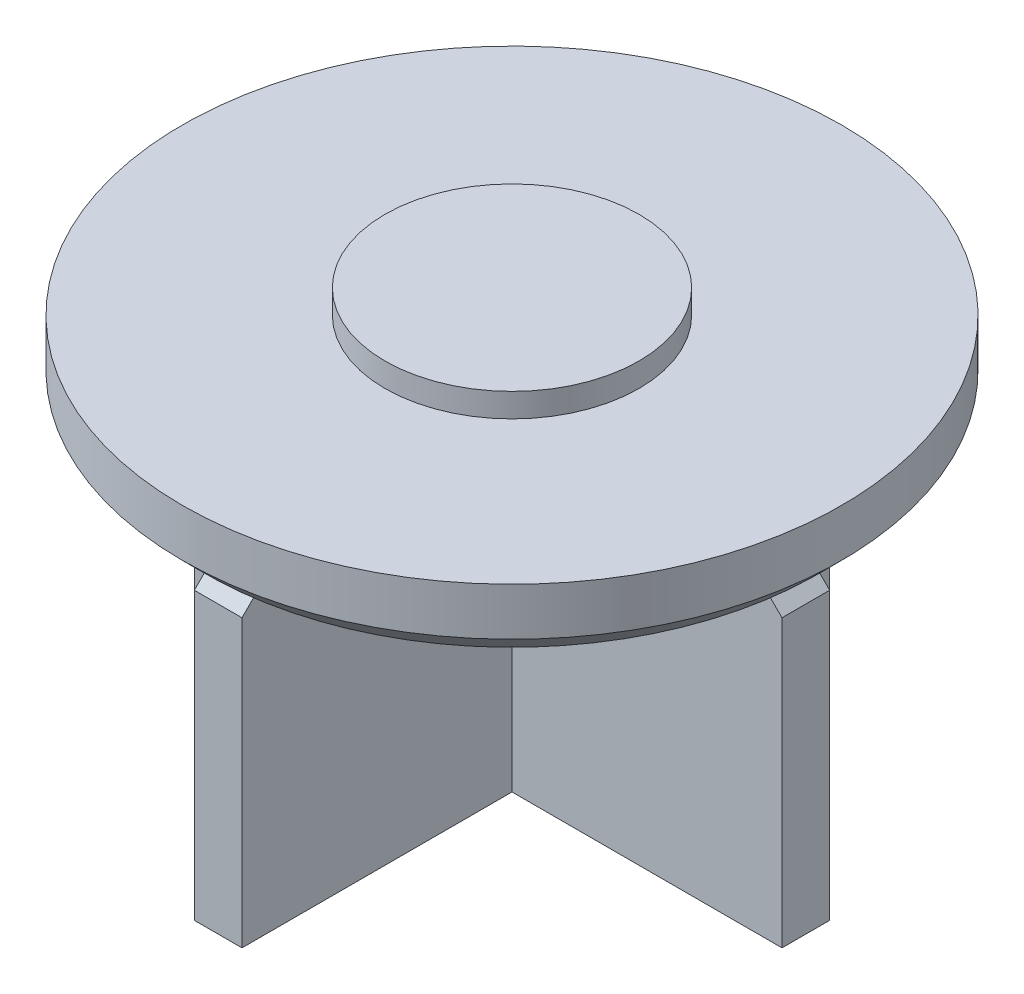
ISO-10303-21;
HEADER;
FILE_DESCRIPTION(('STEP AP214'),'2;1');
FILE_NAME('part.step','',(''),(''),'','','');
FILE_SCHEMA(('AUTOMOTIVE_DESIGN { 1 0 10303 214 1 1 1 1 }'));
ENDSEC;
DATA;
#1=APPLICATION_CONTEXT('core data for automotive mechanical design processes');
#2=APPLICATION_PROTOCOL_DEFINITION('international standard','automotive_design',2000,#1);
#3=PRODUCT_CONTEXT('',#1,'mechanical');
#4=PRODUCT('Part','Part','',(#3));
#5=PRODUCT_RELATED_PRODUCT_CATEGORY('part','',(#4));
#6=PRODUCT_DEFINITION_FORMATION('','',#4);
#7=PRODUCT_DEFINITION_CONTEXT('part definition',#1,'design');
#8=PRODUCT_DEFINITION('design','',#6,#7);
#9=PRODUCT_DEFINITION_SHAPE('','',#8);
#10=(LENGTH_UNIT() NAMED_UNIT(*) SI_UNIT(.MILLI.,.METRE.));
#11=(NAMED_UNIT(*) PLANE_ANGLE_UNIT() SI_UNIT($,.RADIAN.));
#12=(NAMED_UNIT(*) SI_UNIT($,.STERADIAN.) SOLID_ANGLE_UNIT());
#13=UNCERTAINTY_MEASURE_WITH_UNIT(LENGTH_MEASURE(1.E-05),#10,'distance_accuracy_value','');
#14=(GEOMETRIC_REPRESENTATION_CONTEXT(3) GLOBAL_UNCERTAINTY_ASSIGNED_CONTEXT((#13)) GLOBAL_UNIT_ASSIGNED_CONTEXT((#10,
#11,#12)) REPRESENTATION_CONTEXT('',''));
#15=CARTESIAN_POINT('',(0.,0.,0.));
#16=DIRECTION('',(0.,0.,1.));
#17=DIRECTION('',(1.,0.,0.));
#18=AXIS2_PLACEMENT_3D('',#15,#16,#17);
#19=CARTESIAN_POINT('',(0.,0.,0.));
#20=DIRECTION('',(0.,-1.,0.));
#21=DIRECTION('',(0.,0.,-1.));
#22=AXIS2_PLACEMENT_3D('',#19,#20,#21);
#23=PLANE('',#22);
#24=CARTESIAN_POINT('',(0.,0.,0.));
#25=DIRECTION('',(0.,-1.,0.));
#26=DIRECTION('',(0.,0.,-1.));
#27=AXIS2_PLACEMENT_3D('',#24,#25,#26);
#28=CIRCLE('',#27,16.);
#29=CARTESIAN_POINT('',(0.,0.,-16.));
#30=VERTEX_POINT('',#29);
#31=EDGE_CURVE('E40',#30,#30,#28,.T.);
#32=ORIENTED_EDGE('',*,*,#31,.F.);
#33=EDGE_LOOP('',(#32));
#34=FACE_BOUND('',#33,.T.);
#35=ADVANCED_FACE('F33',(#34),#23,.F.);
#36=CARTESIAN_POINT('',(0.,-12.,0.));
#37=DIRECTION('',(0.,-1.,0.));
#38=DIRECTION('',(0.,0.,-1.));
#39=AXIS2_PLACEMENT_3D('',#36,#37,#38);
#40=CYLINDRICAL_SURFACE('',#39,16.);
#41=CARTESIAN_POINT('',(0.,-3.,0.));
#42=DIRECTION('',(0.,-1.,0.));
#43=DIRECTION('',(0.,0.,-1.));
#44=AXIS2_PLACEMENT_3D('',#41,#42,#43);
#45=CIRCLE('',#44,16.);
#46=CARTESIAN_POINT('',(0.,-3.,-16.));
#47=VERTEX_POINT('',#46);
#48=EDGE_CURVE('E274',#47,#47,#45,.T.);
#49=ORIENTED_EDGE('',*,*,#48,.F.);
#50=EDGE_LOOP('',(#49));
#51=FACE_BOUND('',#50,.T.);
#52=ORIENTED_EDGE('',*,*,#31,.T.);
#53=EDGE_LOOP('',(#52));
#54=FACE_BOUND('',#53,.T.);
#55=ADVANCED_FACE('F279',(#51,#54),#40,.T.);
#56=CARTESIAN_POINT('',(-16.,-3.,0.));
#57=DIRECTION('',(0.,-1.,0.));
#58=DIRECTION('',(0.,0.,-1.));
#59=AXIS2_PLACEMENT_3D('',#56,#57,#58);
#60=PLANE('',#59);
#61=CARTESIAN_POINT('',(0.,-3.,0.));
#62=DIRECTION('',(0.,-1.,0.));
#63=DIRECTION('',(0.,0.,-1.));
#64=AXIS2_PLACEMENT_3D('',#61,#62,#63);
#65=CIRCLE('',#64,41.5);
#66=CARTESIAN_POINT('',(0.,-3.,-41.5));
#67=VERTEX_POINT('',#66);
#68=EDGE_CURVE('E271',#67,#67,#65,.T.);
#69=ORIENTED_EDGE('',*,*,#68,.F.);
#70=EDGE_LOOP('',(#69));
#71=FACE_BOUND('',#70,.T.);
#72=ORIENTED_EDGE('',*,*,#48,.T.);
#73=EDGE_LOOP('',(#72));
#74=FACE_BOUND('',#73,.T.);
#75=ADVANCED_FACE('F285',(#71,#74),#60,.F.);
#76=CARTESIAN_POINT('',(0.,-12.,0.));
#77=DIRECTION('',(0.,-1.,0.));
#78=DIRECTION('',(0.,0.,-1.));
#79=AXIS2_PLACEMENT_3D('',#76,#77,#78);
#80=CYLINDRICAL_SURFACE('',#79,41.5);
#81=CARTESIAN_POINT('',(0.,-9.00000000000001,0.));
#82=DIRECTION('',(0.,-1.,0.));
#83=DIRECTION('',(0.,0.,-1.));
#84=AXIS2_PLACEMENT_3D('',#81,#82,#83);
#85=CIRCLE('',#84,41.5);
#86=CARTESIAN_POINT('',(0.,-9.00000000000001,-41.5));
#87=VERTEX_POINT('',#86);
#88=EDGE_CURVE('E268',#87,#87,#85,.T.);
#89=ORIENTED_EDGE('',*,*,#88,.F.);
#90=EDGE_LOOP('',(#89));
#91=FACE_BOUND('',#90,.T.);
#92=ORIENTED_EDGE('',*,*,#68,.T.);
#93=EDGE_LOOP('',(#92));
#94=FACE_BOUND('',#93,.T.);
#95=ADVANCED_FACE('F290',(#91,#94),#80,.T.);
#96=CARTESIAN_POINT('',(0.,-9.00000000000001,0.));
#97=DIRECTION('',(0.,1.,0.));
#98=DIRECTION('',(0.,0.,1.));
#99=AXIS2_PLACEMENT_3D('',#96,#97,#98);
#100=CONICAL_SURFACE('',#99,41.5,0.78539816339745);
#101=CARTESIAN_POINT('',(0.,-12.,0.));
#102=DIRECTION('',(0.,-1.,0.));
#103=DIRECTION('',(0.,0.,-1.));
#104=AXIS2_PLACEMENT_3D('',#101,#102,#103);
#105=CIRCLE('',#104,38.5);
#106=CARTESIAN_POINT('',(0.,-12.,-38.5));
#107=VERTEX_POINT('',#106);
#108=EDGE_CURVE('E265',#107,#107,#105,.T.);
#109=ORIENTED_EDGE('',*,*,#108,.F.);
#110=EDGE_LOOP('',(#109));
#111=FACE_BOUND('',#110,.T.);
#112=ORIENTED_EDGE('',*,*,#88,.T.);
#113=EDGE_LOOP('',(#112));
#114=FACE_BOUND('',#113,.T.);
#115=ADVANCED_FACE('F297',(#111,#114),#100,.T.);
#116=CARTESIAN_POINT('',(-38.5,-12.,0.));
#117=DIRECTION('',(0.,1.,0.));
#118=DIRECTION('',(0.,0.,1.));
#119=AXIS2_PLACEMENT_3D('',#116,#117,#118);
#120=PLANE('',#119);
#121=DIRECTION('',(-1.,0.,0.));
#122=VECTOR('',#121,1.);
#123=CARTESIAN_POINT('',(33.,-12.,-3.));
#124=LINE('',#123,#122);
#125=CARTESIAN_POINT('',(33.,-12.,-3.));
#126=VERTEX_POINT('',#125);
#127=CARTESIAN_POINT('',(2.99999999999999,-12.,-3.));
#128=VERTEX_POINT('',#127);
#129=EDGE_CURVE('E240',#126,#128,#124,.T.);
#130=ORIENTED_EDGE('',*,*,#129,.T.);
#131=DIRECTION('',(0.,0.,1.));
#132=VECTOR('',#131,1.);
#133=CARTESIAN_POINT('',(2.99999999999988,-12.,-33.));
#134=LINE('',#133,#132);
#135=CARTESIAN_POINT('',(2.99999999999988,-12.,-33.));
#136=VERTEX_POINT('',#135);
#137=EDGE_CURVE('E47',#136,#128,#134,.T.);
#138=ORIENTED_EDGE('',*,*,#137,.F.);
#139=DIRECTION('',(-1.,0.,0.));
#140=VECTOR('',#139,1.);
#141=CARTESIAN_POINT('',(2.99999999999988,-12.,-33.));
#142=LINE('',#141,#140);
#143=CARTESIAN_POINT('',(-3.00000000000012,-12.,-33.));
#144=VERTEX_POINT('',#143);
#145=EDGE_CURVE('E218',#136,#144,#142,.T.);
#146=ORIENTED_EDGE('',*,*,#145,.T.);
#147=DIRECTION('',(0.,0.,1.));
#148=VECTOR('',#147,1.);
#149=CARTESIAN_POINT('',(-3.00000000000012,-12.,-33.));
#150=LINE('',#149,#148);
#151=CARTESIAN_POINT('',(-3.00000000000001,-12.,-3.));
#152=VERTEX_POINT('',#151);
#153=EDGE_CURVE('E209',#144,#152,#150,.T.);
#154=ORIENTED_EDGE('',*,*,#153,.T.);
#155=DIRECTION('',(1.,0.,0.));
#156=VECTOR('',#155,1.);
#157=CARTESIAN_POINT('',(-33.,-12.,-3.));
#158=LINE('',#157,#156);
#159=CARTESIAN_POINT('',(-33.,-12.,-3.));
#160=VERTEX_POINT('',#159);
#161=EDGE_CURVE('E183',#160,#152,#158,.T.);
#162=ORIENTED_EDGE('',*,*,#161,.F.);
#163=DIRECTION('',(0.,0.,1.));
#164=VECTOR('',#163,1.);
#165=CARTESIAN_POINT('',(-33.,-12.,-3.));
#166=LINE('',#165,#164);
#167=CARTESIAN_POINT('',(-33.,-12.,3.));
#168=VERTEX_POINT('',#167);
#169=EDGE_CURVE('E192',#160,#168,#166,.T.);
#170=ORIENTED_EDGE('',*,*,#169,.T.);
#171=DIRECTION('',(1.,0.,0.));
#172=VECTOR('',#171,1.);
#173=CARTESIAN_POINT('',(-33.,-12.,3.));
#174=LINE('',#173,#172);
#175=CARTESIAN_POINT('',(-2.99999999999997,-12.,3.));
#176=VERTEX_POINT('',#175);
#177=EDGE_CURVE('E163',#168,#176,#174,.T.);
#178=ORIENTED_EDGE('',*,*,#177,.T.);
#179=DIRECTION('',(0.,0.,-1.));
#180=VECTOR('',#179,1.);
#181=CARTESIAN_POINT('',(-2.99999999999965,-12.,33.));
#182=LINE('',#181,#180);
#183=CARTESIAN_POINT('',(-2.99999999999965,-12.,33.));
#184=VERTEX_POINT('',#183);
#185=EDGE_CURVE('E154',#184,#176,#182,.T.);
#186=ORIENTED_EDGE('',*,*,#185,.F.);
#187=DIRECTION('',(1.,0.,0.));
#188=VECTOR('',#187,1.);
#189=CARTESIAN_POINT('',(-2.99999999999965,-12.,33.));
#190=LINE('',#189,#188);
#191=CARTESIAN_POINT('',(3.00000000000035,-12.,33.));
#192=VERTEX_POINT('',#191);
#193=EDGE_CURVE('E171',#184,#192,#190,.T.);
#194=ORIENTED_EDGE('',*,*,#193,.T.);
#195=CARTESIAN_POINT('',(3.00000000000001,-12.,3.));
#196=VERTEX_POINT('',#195);
#197=EDGE_CURVE('E212',#196,#192,#134,.T.);
#198=ORIENTED_EDGE('',*,*,#197,.F.);
#199=DIRECTION('',(-1.,0.,0.));
#200=VECTOR('',#199,1.);
#201=CARTESIAN_POINT('',(33.,-12.,3.));
#202=LINE('',#201,#200);
#203=CARTESIAN_POINT('',(33.,-12.,3.));
#204=VERTEX_POINT('',#203);
#205=EDGE_CURVE('E54',#204,#196,#202,.T.);
#206=ORIENTED_EDGE('',*,*,#205,.F.);
#207=DIRECTION('',(0.,0.,-1.));
#208=VECTOR('',#207,1.);
#209=CARTESIAN_POINT('',(33.,-12.,3.));
#210=LINE('',#209,#208);
#211=EDGE_CURVE('E249',#204,#126,#210,.T.);
#212=ORIENTED_EDGE('',*,*,#211,.T.);
#213=EDGE_LOOP('',(#130,#138,#146,#154,#162,#170,#178,#186,#194,#198,#206,#212));
#214=FACE_BOUND('',#213,.T.);
#215=ORIENTED_EDGE('',*,*,#108,.T.);
#216=EDGE_LOOP('',(#215));
#217=FACE_BOUND('',#216,.T.);
#218=ADVANCED_FACE('F301',(#214,#217),#120,.F.);
#219=CARTESIAN_POINT('',(0.,-52.,3.));
#220=DIRECTION('',(0.,1.,0.));
#221=DIRECTION('',(0.,0.,1.));
#222=AXIS2_PLACEMENT_3D('',#219,#220,#221);
#223=PLANE('',#222);
#224=DIRECTION('',(1.,0.,0.));
#225=VECTOR('',#224,1.);
#226=CARTESIAN_POINT('',(0.,-52.,3.));
#227=LINE('',#226,#225);
#228=CARTESIAN_POINT('',(3.00000000000001,-52.,3.));
#229=VERTEX_POINT('',#228);
#230=CARTESIAN_POINT('',(37.,-52.,3.));
#231=VERTEX_POINT('',#230);
#232=EDGE_CURVE('E242',#229,#231,#227,.T.);
#233=ORIENTED_EDGE('',*,*,#232,.F.);
#234=DIRECTION('',(0.,0.,-1.));
#235=VECTOR('',#234,1.);
#236=CARTESIAN_POINT('',(3.,-52.,0.));
#237=LINE('',#236,#235);
#238=CARTESIAN_POINT('',(3.00000000000039,-52.,37.));
#239=VERTEX_POINT('',#238);
#240=EDGE_CURVE('E160',#239,#229,#237,.T.);
#241=ORIENTED_EDGE('',*,*,#240,.F.);
#242=DIRECTION('',(1.,0.,0.));
#243=VECTOR('',#242,1.);
#244=CARTESIAN_POINT('',(-2.99999999999961,-52.,37.));
#245=LINE('',#244,#243);
#246=CARTESIAN_POINT('',(-2.99999999999961,-52.,37.));
#247=VERTEX_POINT('',#246);
#248=EDGE_CURVE('E157',#247,#239,#245,.T.);
#249=ORIENTED_EDGE('',*,*,#248,.F.);
#250=DIRECTION('',(0.,0.,1.));
#251=VECTOR('',#250,1.);
#252=CARTESIAN_POINT('',(-3.,-52.,0.));
#253=LINE('',#252,#251);
#254=CARTESIAN_POINT('',(-2.99999999999997,-52.,3.));
#255=VERTEX_POINT('',#254);
#256=EDGE_CURVE('E144',#255,#247,#253,.T.);
#257=ORIENTED_EDGE('',*,*,#256,.F.);
#258=DIRECTION('',(-1.,0.,0.));
#259=VECTOR('',#258,1.);
#260=CARTESIAN_POINT('',(0.,-52.,3.));
#261=LINE('',#260,#259);
#262=CARTESIAN_POINT('',(-37.,-52.,3.));
#263=VERTEX_POINT('',#262);
#264=EDGE_CURVE('E195',#255,#263,#261,.T.);
#265=ORIENTED_EDGE('',*,*,#264,.T.);
#266=DIRECTION('',(0.,0.,1.));
#267=VECTOR('',#266,1.);
#268=CARTESIAN_POINT('',(-37.,-52.,-3.));
#269=LINE('',#268,#267);
#270=CARTESIAN_POINT('',(-37.,-52.,-3.));
#271=VERTEX_POINT('',#270);
#272=EDGE_CURVE('E205',#271,#263,#269,.T.);
#273=ORIENTED_EDGE('',*,*,#272,.F.);
#274=DIRECTION('',(-1.,0.,0.));
#275=VECTOR('',#274,1.);
#276=CARTESIAN_POINT('',(0.,-52.,-3.));
#277=LINE('',#276,#275);
#278=CARTESIAN_POINT('',(-3.00000000000001,-52.,-3.));
#279=VERTEX_POINT('',#278);
#280=EDGE_CURVE('E185',#279,#271,#277,.T.);
#281=ORIENTED_EDGE('',*,*,#280,.F.);
#282=DIRECTION('',(0.,0.,-1.));
#283=VECTOR('',#282,1.);
#284=CARTESIAN_POINT('',(-3.,-52.,0.));
#285=LINE('',#284,#283);
#286=CARTESIAN_POINT('',(-3.00000000000013,-52.,-37.));
#287=VERTEX_POINT('',#286);
#288=EDGE_CURVE('E221',#279,#287,#285,.T.);
#289=ORIENTED_EDGE('',*,*,#288,.T.);
#290=DIRECTION('',(-1.,0.,0.));
#291=VECTOR('',#290,1.);
#292=CARTESIAN_POINT('',(2.99999999999987,-52.,-37.));
#293=LINE('',#292,#291);
#294=CARTESIAN_POINT('',(2.99999999999987,-52.,-37.));
#295=VERTEX_POINT('',#294);
#296=EDGE_CURVE('E232',#295,#287,#293,.T.);
#297=ORIENTED_EDGE('',*,*,#296,.F.);
#298=CARTESIAN_POINT('',(2.99999999999999,-52.,-3.));
#299=VERTEX_POINT('',#298);
#300=EDGE_CURVE('E211',#299,#295,#237,.T.);
#301=ORIENTED_EDGE('',*,*,#300,.F.);
#302=DIRECTION('',(1.,0.,0.));
#303=VECTOR('',#302,1.);
#304=CARTESIAN_POINT('',(0.,-52.,-3.));
#305=LINE('',#304,#303);
#306=CARTESIAN_POINT('',(37.,-52.,-3.));
#307=VERTEX_POINT('',#306);
#308=EDGE_CURVE('E252',#299,#307,#305,.T.);
#309=ORIENTED_EDGE('',*,*,#308,.T.);
#310=DIRECTION('',(0.,0.,-1.));
#311=VECTOR('',#310,1.);
#312=CARTESIAN_POINT('',(37.,-52.,3.));
#313=LINE('',#312,#311);
#314=EDGE_CURVE('E262',#231,#307,#313,.T.);
#315=ORIENTED_EDGE('',*,*,#314,.F.);
#316=EDGE_LOOP('',(#233,#241,#249,#257,#265,#273,#281,#289,#297,#301,#309,#315));
#317=FACE_BOUND('',#316,.T.);
#318=ADVANCED_FACE('F159',(#317),#223,.F.);
#319=CARTESIAN_POINT('',(37.,-52.,3.));
#320=DIRECTION('',(-1.,0.,0.));
#321=DIRECTION('',(0.,0.,1.));
#322=AXIS2_PLACEMENT_3D('',#319,#320,#321);
#323=PLANE('',#322);
#324=DIRECTION('',(0.,1.,0.));
#325=VECTOR('',#324,1.);
#326=CARTESIAN_POINT('',(37.,-52.,-3.));
#327=LINE('',#326,#325);
#328=CARTESIAN_POINT('',(37.,-16.,-3.));
#329=VERTEX_POINT('',#328);
#330=EDGE_CURVE('E254',#307,#329,#327,.T.);
#331=ORIENTED_EDGE('',*,*,#330,.T.);
#332=DIRECTION('',(0.,0.,-1.));
#333=VECTOR('',#332,1.);
#334=CARTESIAN_POINT('',(37.,-16.,3.));
#335=LINE('',#334,#333);
#336=CARTESIAN_POINT('',(37.,-16.,3.));
#337=VERTEX_POINT('',#336);
#338=EDGE_CURVE('E259',#337,#329,#335,.T.);
#339=ORIENTED_EDGE('',*,*,#338,.F.);
#340=DIRECTION('',(0.,1.,0.));
#341=VECTOR('',#340,1.);
#342=CARTESIAN_POINT('',(37.,-52.,3.));
#343=LINE('',#342,#341);
#344=EDGE_CURVE('E245',#231,#337,#343,.T.);
#345=ORIENTED_EDGE('',*,*,#344,.F.);
#346=ORIENTED_EDGE('',*,*,#314,.T.);
#347=EDGE_LOOP('',(#331,#339,#345,#346));
#348=FACE_BOUND('',#347,.T.);
#349=ADVANCED_FACE('F307',(#348),#323,.F.);
#350=CARTESIAN_POINT('',(37.,-16.,3.));
#351=DIRECTION('',(-0.707106781186548,-0.707106781186546,0.));
#352=DIRECTION('',(0.707106781186546,-0.707106781186549,0.));
#353=AXIS2_PLACEMENT_3D('',#350,#351,#352);
#354=PLANE('',#353);
#355=DIRECTION('',(-0.707106781186546,0.707106781186549,0.));
#356=VECTOR('',#355,1.);
#357=CARTESIAN_POINT('',(37.,-16.,-3.));
#358=LINE('',#357,#356);
#359=EDGE_CURVE('E243',#329,#126,#358,.T.);
#360=ORIENTED_EDGE('',*,*,#359,.T.);
#361=ORIENTED_EDGE('',*,*,#211,.F.);
#362=DIRECTION('',(-0.707106781186546,0.707106781186549,0.));
#363=VECTOR('',#362,1.);
#364=CARTESIAN_POINT('',(37.,-16.,3.));
#365=LINE('',#364,#363);
#366=EDGE_CURVE('E247',#337,#204,#365,.T.);
#367=ORIENTED_EDGE('',*,*,#366,.F.);
#368=ORIENTED_EDGE('',*,*,#338,.T.);
#369=EDGE_LOOP('',(#360,#361,#367,#368));
#370=FACE_BOUND('',#369,.T.);
#371=ADVANCED_FACE('F310',(#370),#354,.F.);
#372=CARTESIAN_POINT('',(0.,0.,3.));
#373=DIRECTION('',(0.,0.,1.));
#374=DIRECTION('',(1.,0.,0.));
#375=AXIS2_PLACEMENT_3D('',#372,#373,#374);
#376=PLANE('',#375);
#377=DIRECTION('',(0.,1.,0.));
#378=VECTOR('',#377,1.);
#379=CARTESIAN_POINT('',(3.00000000000001,0.,3.));
#380=LINE('',#379,#378);
#381=EDGE_CURVE('E238',#229,#196,#380,.T.);
#382=ORIENTED_EDGE('',*,*,#381,.F.);
#383=ORIENTED_EDGE('',*,*,#232,.T.);
#384=ORIENTED_EDGE('',*,*,#344,.T.);
#385=ORIENTED_EDGE('',*,*,#366,.T.);
#386=ORIENTED_EDGE('',*,*,#205,.T.);
#387=EDGE_LOOP('',(#382,#383,#384,#385,#386));
#388=FACE_BOUND('',#387,.T.);
#389=ADVANCED_FACE('F314',(#388),#376,.T.);
#390=CARTESIAN_POINT('',(0.,0.,-3.));
#391=DIRECTION('',(0.,0.,1.));
#392=DIRECTION('',(1.,0.,0.));
#393=AXIS2_PLACEMENT_3D('',#390,#391,#392);
#394=PLANE('',#393);
#395=ORIENTED_EDGE('',*,*,#308,.F.);
#396=DIRECTION('',(0.,1.,0.));
#397=VECTOR('',#396,1.);
#398=CARTESIAN_POINT('',(2.99999999999999,0.,-3.));
#399=LINE('',#398,#397);
#400=EDGE_CURVE('E11',#299,#128,#399,.T.);
#401=ORIENTED_EDGE('',*,*,#400,.T.);
#402=ORIENTED_EDGE('',*,*,#129,.F.);
#403=ORIENTED_EDGE('',*,*,#359,.F.);
#404=ORIENTED_EDGE('',*,*,#330,.F.);
#405=EDGE_LOOP('',(#395,#401,#402,#403,#404));
#406=FACE_BOUND('',#405,.T.);
#407=ADVANCED_FACE('F316',(#406),#394,.F.);
#408=CARTESIAN_POINT('',(3.,0.,0.));
#409=DIRECTION('',(1.,0.,0.));
#410=DIRECTION('',(0.,0.,-1.));
#411=AXIS2_PLACEMENT_3D('',#408,#409,#410);
#412=PLANE('',#411);
#413=ORIENTED_EDGE('',*,*,#400,.F.);
#414=ORIENTED_EDGE('',*,*,#300,.T.);
#415=DIRECTION('',(0.,1.,0.));
#416=VECTOR('',#415,1.);
#417=CARTESIAN_POINT('',(2.99999999999987,-52.,-37.));
#418=LINE('',#417,#416);
#419=CARTESIAN_POINT('',(2.99999999999987,-16.,-37.));
#420=VERTEX_POINT('',#419);
#421=EDGE_CURVE('E214',#295,#420,#418,.T.);
#422=ORIENTED_EDGE('',*,*,#421,.T.);
#423=DIRECTION('',(0.,0.707106781186549,0.707106781186546));
#424=VECTOR('',#423,1.);
#425=CARTESIAN_POINT('',(2.99999999999987,-16.,-37.));
#426=LINE('',#425,#424);
#427=EDGE_CURVE('E216',#420,#136,#426,.T.);
#428=ORIENTED_EDGE('',*,*,#427,.T.);
#429=ORIENTED_EDGE('',*,*,#137,.T.);
#430=EDGE_LOOP('',(#413,#414,#422,#428,#429));
#431=FACE_BOUND('',#430,.T.);
#432=ADVANCED_FACE('F319',(#431),#412,.T.);
#433=CARTESIAN_POINT('',(2.99999999999987,-52.,-37.));
#434=DIRECTION('',(0.,0.,1.));
#435=DIRECTION('',(1.,0.,0.));
#436=AXIS2_PLACEMENT_3D('',#433,#434,#435);
#437=PLANE('',#436);
#438=DIRECTION('',(0.,1.,0.));
#439=VECTOR('',#438,1.);
#440=CARTESIAN_POINT('',(-3.00000000000013,-52.,-37.));
#441=LINE('',#440,#439);
#442=CARTESIAN_POINT('',(-3.00000000000013,-16.,-37.));
#443=VERTEX_POINT('',#442);
#444=EDGE_CURVE('E223',#287,#443,#441,.T.);
#445=ORIENTED_EDGE('',*,*,#444,.T.);
#446=DIRECTION('',(-1.,0.,0.));
#447=VECTOR('',#446,1.);
#448=CARTESIAN_POINT('',(2.99999999999987,-16.,-37.));
#449=LINE('',#448,#447);
#450=EDGE_CURVE('E229',#420,#443,#449,.T.);
#451=ORIENTED_EDGE('',*,*,#450,.F.);
#452=ORIENTED_EDGE('',*,*,#421,.F.);
#453=ORIENTED_EDGE('',*,*,#296,.T.);
#454=EDGE_LOOP('',(#445,#451,#452,#453));
#455=FACE_BOUND('',#454,.T.);
#456=ADVANCED_FACE('F324',(#455),#437,.F.);
#457=CARTESIAN_POINT('',(2.99999999999987,-16.,-37.));
#458=DIRECTION('',(0.,-0.707106781186546,0.707106781186548));
#459=DIRECTION('',(0.,-0.707106781186549,-0.707106781186546));
#460=AXIS2_PLACEMENT_3D('',#457,#458,#459);
#461=PLANE('',#460);
#462=DIRECTION('',(0.,0.707106781186549,0.707106781186546));
#463=VECTOR('',#462,1.);
#464=CARTESIAN_POINT('',(-3.00000000000013,-16.,-37.));
#465=LINE('',#464,#463);
#466=EDGE_CURVE('E225',#443,#144,#465,.T.);
#467=ORIENTED_EDGE('',*,*,#466,.T.);
#468=ORIENTED_EDGE('',*,*,#145,.F.);
#469=ORIENTED_EDGE('',*,*,#427,.F.);
#470=ORIENTED_EDGE('',*,*,#450,.T.);
#471=EDGE_LOOP('',(#467,#468,#469,#470));
#472=FACE_BOUND('',#471,.T.);
#473=ADVANCED_FACE('F327',(#472),#461,.F.);
#474=ORIENTED_EDGE('',*,*,#240,.T.);
#475=ORIENTED_EDGE('',*,*,#381,.T.);
#476=ORIENTED_EDGE('',*,*,#197,.T.);
#477=DIRECTION('',(0.,0.707106781186549,-0.707106781186546));
#478=VECTOR('',#477,1.);
#479=CARTESIAN_POINT('',(3.00000000000039,-16.,37.));
#480=LINE('',#479,#478);
#481=CARTESIAN_POINT('',(3.00000000000039,-16.,37.));
#482=VERTEX_POINT('',#481);
#483=EDGE_CURVE('E177',#482,#192,#480,.T.);
#484=ORIENTED_EDGE('',*,*,#483,.F.);
#485=DIRECTION('',(0.,1.,0.));
#486=VECTOR('',#485,1.);
#487=CARTESIAN_POINT('',(3.00000000000039,-52.,37.));
#488=LINE('',#487,#486);
#489=EDGE_CURVE('E175',#239,#482,#488,.T.);
#490=ORIENTED_EDGE('',*,*,#489,.F.);
#491=EDGE_LOOP('',(#474,#475,#476,#484,#490));
#492=FACE_BOUND('',#491,.T.);
#493=ADVANCED_FACE('F331',(#492),#412,.T.);
#494=CARTESIAN_POINT('',(-3.,0.,0.));
#495=DIRECTION('',(1.,0.,0.));
#496=DIRECTION('',(0.,0.,-1.));
#497=AXIS2_PLACEMENT_3D('',#494,#495,#496);
#498=PLANE('',#497);
#499=ORIENTED_EDGE('',*,*,#288,.F.);
#500=DIRECTION('',(0.,1.,0.));
#501=VECTOR('',#500,1.);
#502=CARTESIAN_POINT('',(-3.00000000000001,0.,-3.));
#503=LINE('',#502,#501);
#504=EDGE_CURVE('E235',#279,#152,#503,.T.);
#505=ORIENTED_EDGE('',*,*,#504,.T.);
#506=ORIENTED_EDGE('',*,*,#153,.F.);
#507=ORIENTED_EDGE('',*,*,#466,.F.);
#508=ORIENTED_EDGE('',*,*,#444,.F.);
#509=EDGE_LOOP('',(#499,#505,#506,#507,#508));
#510=FACE_BOUND('',#509,.T.);
#511=ADVANCED_FACE('F333',(#510),#498,.F.);
#512=CARTESIAN_POINT('',(0.,0.,-3.));
#513=DIRECTION('',(0.,0.,-1.));
#514=DIRECTION('',(-1.,0.,0.));
#515=AXIS2_PLACEMENT_3D('',#512,#513,#514);
#516=PLANE('',#515);
#517=ORIENTED_EDGE('',*,*,#504,.F.);
#518=ORIENTED_EDGE('',*,*,#280,.T.);
#519=DIRECTION('',(0.,1.,0.));
#520=VECTOR('',#519,1.);
#521=CARTESIAN_POINT('',(-37.,-52.,-3.));
#522=LINE('',#521,#520);
#523=CARTESIAN_POINT('',(-37.,-16.,-3.));
#524=VERTEX_POINT('',#523);
#525=EDGE_CURVE('E188',#271,#524,#522,.T.);
#526=ORIENTED_EDGE('',*,*,#525,.T.);
#527=DIRECTION('',(0.707106781186546,0.707106781186549,0.));
#528=VECTOR('',#527,1.);
#529=CARTESIAN_POINT('',(-37.,-16.,-3.));
#530=LINE('',#529,#528);
#531=EDGE_CURVE('E190',#524,#160,#530,.T.);
#532=ORIENTED_EDGE('',*,*,#531,.T.);
#533=ORIENTED_EDGE('',*,*,#161,.T.);
#534=EDGE_LOOP('',(#517,#518,#526,#532,#533));
#535=FACE_BOUND('',#534,.T.);
#536=ADVANCED_FACE('F336',(#535),#516,.T.);
#537=CARTESIAN_POINT('',(-37.,-52.,-3.));
#538=DIRECTION('',(1.,0.,0.));
#539=DIRECTION('',(0.,0.,-1.));
#540=AXIS2_PLACEMENT_3D('',#537,#538,#539);
#541=PLANE('',#540);
#542=DIRECTION('',(0.,1.,0.));
#543=VECTOR('',#542,1.);
#544=CARTESIAN_POINT('',(-37.,-52.,3.));
#545=LINE('',#544,#543);
#546=CARTESIAN_POINT('',(-37.,-16.,3.));
#547=VERTEX_POINT('',#546);
#548=EDGE_CURVE('E197',#263,#547,#545,.T.);
#549=ORIENTED_EDGE('',*,*,#548,.T.);
#550=DIRECTION('',(0.,0.,1.));
#551=VECTOR('',#550,1.);
#552=CARTESIAN_POINT('',(-37.,-16.,-3.));
#553=LINE('',#552,#551);
#554=EDGE_CURVE('E202',#524,#547,#553,.T.);
#555=ORIENTED_EDGE('',*,*,#554,.F.);
#556=ORIENTED_EDGE('',*,*,#525,.F.);
#557=ORIENTED_EDGE('',*,*,#272,.T.);
#558=EDGE_LOOP('',(#549,#555,#556,#557));
#559=FACE_BOUND('',#558,.T.);
#560=ADVANCED_FACE('F341',(#559),#541,.F.);
#561=CARTESIAN_POINT('',(-37.,-16.,-3.));
#562=DIRECTION('',(0.707106781186548,-0.707106781186546,0.));
#563=DIRECTION('',(0.707106781186546,0.707106781186549,0.));
#564=AXIS2_PLACEMENT_3D('',#561,#562,#563);
#565=PLANE('',#564);
#566=DIRECTION('',(0.707106781186546,0.707106781186549,0.));
#567=VECTOR('',#566,1.);
#568=CARTESIAN_POINT('',(-37.,-16.,3.));
#569=LINE('',#568,#567);
#570=EDGE_CURVE('E186',#547,#168,#569,.T.);
#571=ORIENTED_EDGE('',*,*,#570,.T.);
#572=ORIENTED_EDGE('',*,*,#169,.F.);
#573=ORIENTED_EDGE('',*,*,#531,.F.);
#574=ORIENTED_EDGE('',*,*,#554,.T.);
#575=EDGE_LOOP('',(#571,#572,#573,#574));
#576=FACE_BOUND('',#575,.T.);
#577=ADVANCED_FACE('F344',(#576),#565,.F.);
#578=CARTESIAN_POINT('',(0.,0.,3.));
#579=DIRECTION('',(0.,0.,-1.));
#580=DIRECTION('',(-1.,0.,0.));
#581=AXIS2_PLACEMENT_3D('',#578,#579,#580);
#582=PLANE('',#581);
#583=ORIENTED_EDGE('',*,*,#264,.F.);
#584=DIRECTION('',(0.,1.,0.));
#585=VECTOR('',#584,1.);
#586=CARTESIAN_POINT('',(-2.99999999999997,0.,3.));
#587=LINE('',#586,#585);
#588=EDGE_CURVE('E151',#255,#176,#587,.T.);
#589=ORIENTED_EDGE('',*,*,#588,.T.);
#590=ORIENTED_EDGE('',*,*,#177,.F.);
#591=ORIENTED_EDGE('',*,*,#570,.F.);
#592=ORIENTED_EDGE('',*,*,#548,.F.);
#593=EDGE_LOOP('',(#583,#589,#590,#591,#592));
#594=FACE_BOUND('',#593,.T.);
#595=ADVANCED_FACE('F348',(#594),#582,.F.);
#596=CARTESIAN_POINT('',(-3.,0.,0.));
#597=DIRECTION('',(-1.,0.,0.));
#598=DIRECTION('',(0.,0.,1.));
#599=AXIS2_PLACEMENT_3D('',#596,#597,#598);
#600=PLANE('',#599);
#601=ORIENTED_EDGE('',*,*,#588,.F.);
#602=ORIENTED_EDGE('',*,*,#256,.T.);
#603=DIRECTION('',(0.,1.,0.));
#604=VECTOR('',#603,1.);
#605=CARTESIAN_POINT('',(-2.99999999999961,-52.,37.));
#606=LINE('',#605,#604);
#607=CARTESIAN_POINT('',(-2.99999999999961,-16.,37.));
#608=VERTEX_POINT('',#607);
#609=EDGE_CURVE('E148',#247,#608,#606,.T.);
#610=ORIENTED_EDGE('',*,*,#609,.T.);
#611=DIRECTION('',(0.,0.707106781186549,-0.707106781186546));
#612=VECTOR('',#611,1.);
#613=CARTESIAN_POINT('',(-2.99999999999961,-16.,37.));
#614=LINE('',#613,#612);
#615=EDGE_CURVE('E169',#608,#184,#614,.T.);
#616=ORIENTED_EDGE('',*,*,#615,.T.);
#617=ORIENTED_EDGE('',*,*,#185,.T.);
#618=EDGE_LOOP('',(#601,#602,#610,#616,#617));
#619=FACE_BOUND('',#618,.T.);
#620=ADVANCED_FACE('F146',(#619),#600,.T.);
#621=CARTESIAN_POINT('',(-2.99999999999961,-52.,37.));
#622=DIRECTION('',(0.,0.,-1.));
#623=DIRECTION('',(-1.,0.,0.));
#624=AXIS2_PLACEMENT_3D('',#621,#622,#623);
#625=PLANE('',#624);
#626=ORIENTED_EDGE('',*,*,#489,.T.);
#627=DIRECTION('',(1.,0.,0.));
#628=VECTOR('',#627,1.);
#629=CARTESIAN_POINT('',(-2.99999999999961,-16.,37.));
#630=LINE('',#629,#628);
#631=EDGE_CURVE('E164',#608,#482,#630,.T.);
#632=ORIENTED_EDGE('',*,*,#631,.F.);
#633=ORIENTED_EDGE('',*,*,#609,.F.);
#634=ORIENTED_EDGE('',*,*,#248,.T.);
#635=EDGE_LOOP('',(#626,#632,#633,#634));
#636=FACE_BOUND('',#635,.T.);
#637=ADVANCED_FACE('F166',(#636),#625,.F.);
#638=CARTESIAN_POINT('',(-2.99999999999961,-16.,37.));
#639=DIRECTION('',(0.,-0.707106781186546,-0.707106781186548));
#640=DIRECTION('',(0.,0.707106781186549,-0.707106781186546));
#641=AXIS2_PLACEMENT_3D('',#638,#639,#640);
#642=PLANE('',#641);
#643=ORIENTED_EDGE('',*,*,#483,.T.);
#644=ORIENTED_EDGE('',*,*,#193,.F.);
#645=ORIENTED_EDGE('',*,*,#615,.F.);
#646=ORIENTED_EDGE('',*,*,#631,.T.);
#647=EDGE_LOOP('',(#643,#644,#645,#646));
#648=FACE_BOUND('',#647,.T.);
#649=ADVANCED_FACE('F358',(#648),#642,.F.);
#650=CLOSED_SHELL('',(#35,#55,#75,#95,#115,#218,#318,#349,#371,#389,#407,#432,#456,#473,#493,
#511,#536,#560,#577,#595,#620,#637,#649));
#651=MANIFOLD_SOLID_BREP('B2',#650);
#652=ADVANCED_BREP_SHAPE_REPRESENTATION('',(#18,#651),#14);
#653=SHAPE_DEFINITION_REPRESENTATION(#9,#652);
ENDSEC;
END-ISO-10303-21;
